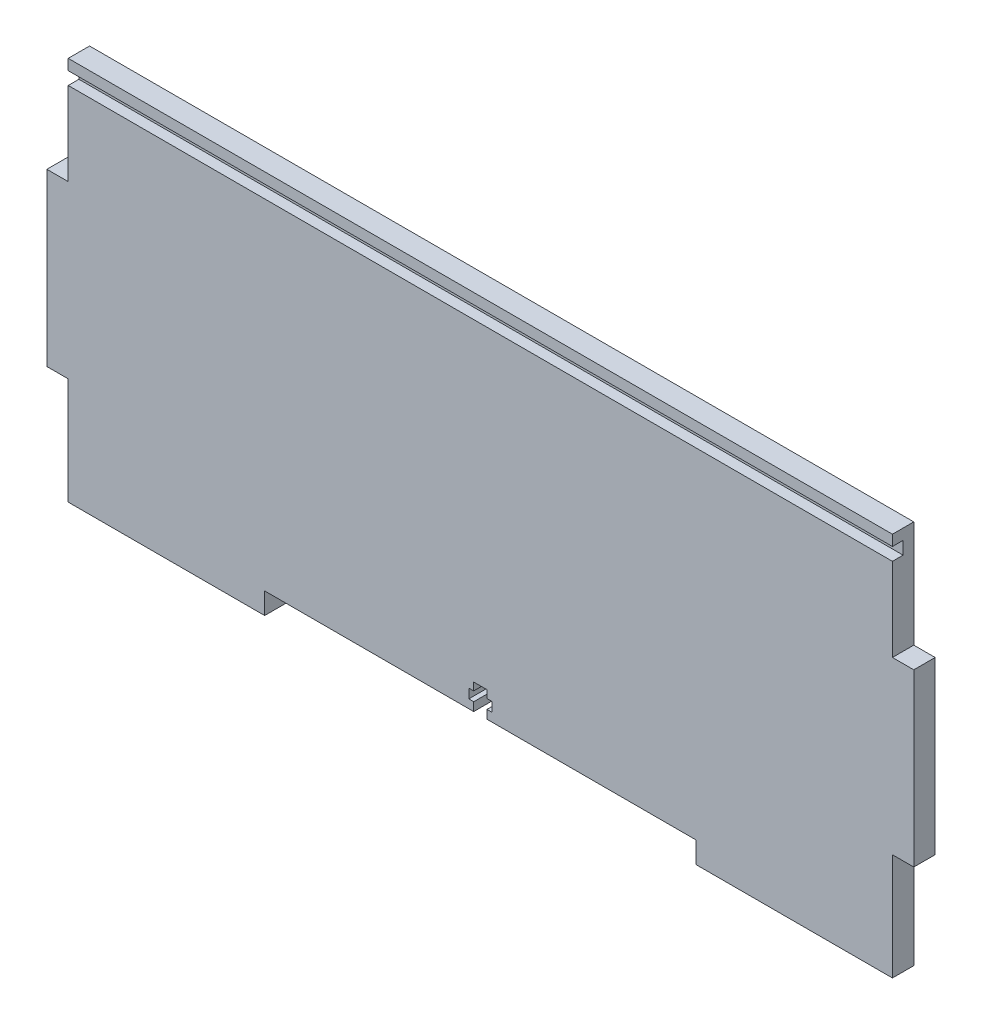
ISO-10303-21;
HEADER;
FILE_DESCRIPTION(('STEP AP214'),'2;1');
FILE_NAME('part.step','',(''),(''),'','','');
FILE_SCHEMA(('AUTOMOTIVE_DESIGN { 1 0 10303 214 1 1 1 1 }'));
ENDSEC;
DATA;
#1=APPLICATION_CONTEXT('core data for automotive mechanical design processes');
#2=APPLICATION_PROTOCOL_DEFINITION('international standard','automotive_design',2000,#1);
#3=PRODUCT_CONTEXT('',#1,'mechanical');
#4=PRODUCT('Part','Part','',(#3));
#5=PRODUCT_RELATED_PRODUCT_CATEGORY('part','',(#4));
#6=PRODUCT_DEFINITION_FORMATION('','',#4);
#7=PRODUCT_DEFINITION_CONTEXT('part definition',#1,'design');
#8=PRODUCT_DEFINITION('design','',#6,#7);
#9=PRODUCT_DEFINITION_SHAPE('','',#8);
#10=(LENGTH_UNIT() NAMED_UNIT(*) SI_UNIT(.MILLI.,.METRE.));
#11=(NAMED_UNIT(*) PLANE_ANGLE_UNIT() SI_UNIT($,.RADIAN.));
#12=(NAMED_UNIT(*) SI_UNIT($,.STERADIAN.) SOLID_ANGLE_UNIT());
#13=UNCERTAINTY_MEASURE_WITH_UNIT(LENGTH_MEASURE(1.E-05),#10,'distance_accuracy_value','');
#14=(GEOMETRIC_REPRESENTATION_CONTEXT(3) GLOBAL_UNCERTAINTY_ASSIGNED_CONTEXT((#13)) GLOBAL_UNIT_ASSIGNED_CONTEXT((#10,
#11,#12)) REPRESENTATION_CONTEXT('',''));
#15=CARTESIAN_POINT('',(0.,0.,0.));
#16=DIRECTION('',(0.,0.,1.));
#17=DIRECTION('',(1.,0.,0.));
#18=AXIS2_PLACEMENT_3D('',#15,#16,#17);
#19=CARTESIAN_POINT('',(0.,0.,5.));
#20=DIRECTION('',(0.,0.,-1.));
#21=DIRECTION('',(-1.,0.,0.));
#22=AXIS2_PLACEMENT_3D('',#19,#20,#21);
#23=PLANE('',#22);
#24=DIRECTION('',(0.,-1.,0.));
#25=VECTOR('',#24,1.);
#26=CARTESIAN_POINT('',(103.05,0.,5.));
#27=LINE('',#26,#25);
#28=CARTESIAN_POINT('',(103.05,7.,5.));
#29=VERTEX_POINT('',#28);
#30=CARTESIAN_POINT('',(103.05,5.,5.));
#31=VERTEX_POINT('',#30);
#32=EDGE_CURVE('E305',#29,#31,#27,.T.);
#33=ORIENTED_EDGE('',*,*,#32,.T.);
#34=DIRECTION('',(-1.,0.,0.));
#35=VECTOR('',#34,1.);
#36=CARTESIAN_POINT('',(51.,5.,5.));
#37=LINE('',#36,#35);
#38=CARTESIAN_POINT('',(152.,5.,5.));
#39=VERTEX_POINT('',#38);
#40=EDGE_CURVE('E388',#39,#31,#37,.T.);
#41=ORIENTED_EDGE('',*,*,#40,.F.);
#42=DIRECTION('',(0.,1.,0.));
#43=VECTOR('',#42,1.);
#44=CARTESIAN_POINT('',(152.,0.,5.));
#45=LINE('',#44,#43);
#46=CARTESIAN_POINT('',(152.,0.,5.));
#47=VERTEX_POINT('',#46);
#48=EDGE_CURVE('E396',#47,#39,#45,.T.);
#49=ORIENTED_EDGE('',*,*,#48,.F.);
#50=DIRECTION('',(1.,0.,0.));
#51=VECTOR('',#50,1.);
#52=CARTESIAN_POINT('',(0.,0.,5.));
#53=LINE('',#52,#51);
#54=CARTESIAN_POINT('',(198.,0.,5.));
#55=VERTEX_POINT('',#54);
#56=EDGE_CURVE('E470',#47,#55,#53,.T.);
#57=ORIENTED_EDGE('',*,*,#56,.T.);
#58=DIRECTION('',(0.,-1.,0.));
#59=VECTOR('',#58,1.);
#60=CARTESIAN_POINT('',(198.,0.,5.));
#61=LINE('',#60,#59);
#62=CARTESIAN_POINT('',(198.,25.,5.));
#63=VERTEX_POINT('',#62);
#64=EDGE_CURVE('E437',#63,#55,#61,.T.);
#65=ORIENTED_EDGE('',*,*,#64,.F.);
#66=DIRECTION('',(-1.,0.,0.));
#67=VECTOR('',#66,1.);
#68=CARTESIAN_POINT('',(203.,25.,5.));
#69=LINE('',#68,#67);
#70=CARTESIAN_POINT('',(203.,25.,5.));
#71=VERTEX_POINT('',#70);
#72=EDGE_CURVE('E379',#71,#63,#69,.T.);
#73=ORIENTED_EDGE('',*,*,#72,.F.);
#74=DIRECTION('',(0.,1.,0.));
#75=VECTOR('',#74,1.);
#76=CARTESIAN_POINT('',(203.,0.,5.));
#77=LINE('',#76,#75);
#78=CARTESIAN_POINT('',(203.,65.,5.));
#79=VERTEX_POINT('',#78);
#80=EDGE_CURVE('E42',#71,#79,#77,.T.);
#81=ORIENTED_EDGE('',*,*,#80,.T.);
#82=DIRECTION('',(1.,0.,0.));
#83=VECTOR('',#82,1.);
#84=CARTESIAN_POINT('',(203.,65.,5.));
#85=LINE('',#84,#83);
#86=CARTESIAN_POINT('',(198.,65.,5.));
#87=VERTEX_POINT('',#86);
#88=EDGE_CURVE('E367',#87,#79,#85,.T.);
#89=ORIENTED_EDGE('',*,*,#88,.F.);
#90=DIRECTION('',(0.,-1.,0.));
#91=VECTOR('',#90,1.);
#92=CARTESIAN_POINT('',(198.,65.,5.));
#93=LINE('',#92,#91);
#94=CARTESIAN_POINT('',(198.,84.5,5.));
#95=VERTEX_POINT('',#94);
#96=EDGE_CURVE('E374',#95,#87,#93,.T.);
#97=ORIENTED_EDGE('',*,*,#96,.F.);
#98=DIRECTION('',(1.,0.,0.));
#99=VECTOR('',#98,1.);
#100=CARTESIAN_POINT('',(4.99999999999998,84.5,5.));
#101=LINE('',#100,#99);
#102=CARTESIAN_POINT('',(4.99999999999998,84.5,5.));
#103=VERTEX_POINT('',#102);
#104=EDGE_CURVE('E321',#103,#95,#101,.T.);
#105=ORIENTED_EDGE('',*,*,#104,.F.);
#106=DIRECTION('',(0.,1.,0.));
#107=VECTOR('',#106,1.);
#108=CARTESIAN_POINT('',(4.99999999999997,65.,5.));
#109=LINE('',#108,#107);
#110=CARTESIAN_POINT('',(4.99999999999997,65.,5.));
#111=VERTEX_POINT('',#110);
#112=EDGE_CURVE('E415',#111,#103,#109,.T.);
#113=ORIENTED_EDGE('',*,*,#112,.F.);
#114=DIRECTION('',(1.,0.,0.));
#115=VECTOR('',#114,1.);
#116=CARTESIAN_POINT('',(0.,65.,5.));
#117=LINE('',#116,#115);
#118=CARTESIAN_POINT('',(0.,65.,5.));
#119=VERTEX_POINT('',#118);
#120=EDGE_CURVE('E419',#119,#111,#117,.T.);
#121=ORIENTED_EDGE('',*,*,#120,.F.);
#122=DIRECTION('',(0.,-1.,0.));
#123=VECTOR('',#122,1.);
#124=CARTESIAN_POINT('',(0.,0.,5.));
#125=LINE('',#124,#123);
#126=CARTESIAN_POINT('',(0.,25.,5.));
#127=VERTEX_POINT('',#126);
#128=EDGE_CURVE('E468',#119,#127,#125,.T.);
#129=ORIENTED_EDGE('',*,*,#128,.T.);
#130=DIRECTION('',(-1.,0.,0.));
#131=VECTOR('',#130,1.);
#132=CARTESIAN_POINT('',(0.,25.,5.));
#133=LINE('',#132,#131);
#134=CARTESIAN_POINT('',(5.,25.,5.));
#135=VERTEX_POINT('',#134);
#136=EDGE_CURVE('E453',#135,#127,#133,.T.);
#137=ORIENTED_EDGE('',*,*,#136,.F.);
#138=DIRECTION('',(0.,1.,0.));
#139=VECTOR('',#138,1.);
#140=CARTESIAN_POINT('',(5.,25.,5.));
#141=LINE('',#140,#139);
#142=CARTESIAN_POINT('',(5.,0.,5.));
#143=VERTEX_POINT('',#142);
#144=EDGE_CURVE('E429',#143,#135,#141,.T.);
#145=ORIENTED_EDGE('',*,*,#144,.F.);
#146=CARTESIAN_POINT('',(51.,0.,5.));
#147=VERTEX_POINT('',#146);
#148=EDGE_CURVE('E471',#143,#147,#53,.T.);
#149=ORIENTED_EDGE('',*,*,#148,.T.);
#150=DIRECTION('',(0.,-1.,0.));
#151=VECTOR('',#150,1.);
#152=CARTESIAN_POINT('',(51.,0.,5.));
#153=LINE('',#152,#151);
#154=CARTESIAN_POINT('',(51.,5.,5.));
#155=VERTEX_POINT('',#154);
#156=EDGE_CURVE('E356',#155,#147,#153,.T.);
#157=ORIENTED_EDGE('',*,*,#156,.F.);
#158=CARTESIAN_POINT('',(99.95,5.,5.));
#159=VERTEX_POINT('',#158);
#160=EDGE_CURVE('E399',#159,#155,#37,.T.);
#161=ORIENTED_EDGE('',*,*,#160,.F.);
#162=DIRECTION('',(0.,-1.,0.));
#163=VECTOR('',#162,1.);
#164=CARTESIAN_POINT('',(99.95,0.,5.));
#165=LINE('',#164,#163);
#166=CARTESIAN_POINT('',(99.95,7.,5.));
#167=VERTEX_POINT('',#166);
#168=EDGE_CURVE('E50',#167,#159,#165,.T.);
#169=ORIENTED_EDGE('',*,*,#168,.F.);
#170=DIRECTION('',(-1.,0.,0.));
#171=VECTOR('',#170,1.);
#172=CARTESIAN_POINT('',(0.,6.99999999999998,5.));
#173=LINE('',#172,#171);
#174=CARTESIAN_POINT('',(98.8,7.,5.));
#175=VERTEX_POINT('',#174);
#176=EDGE_CURVE('E301',#167,#175,#173,.T.);
#177=ORIENTED_EDGE('',*,*,#176,.T.);
#178=DIRECTION('',(0.,1.,0.));
#179=VECTOR('',#178,1.);
#180=CARTESIAN_POINT('',(98.8,0.,5.));
#181=LINE('',#180,#179);
#182=CARTESIAN_POINT('',(98.8,9.2,5.));
#183=VERTEX_POINT('',#182);
#184=EDGE_CURVE('E298',#175,#183,#181,.T.);
#185=ORIENTED_EDGE('',*,*,#184,.T.);
#186=DIRECTION('',(-1.,0.,0.));
#187=VECTOR('',#186,1.);
#188=CARTESIAN_POINT('',(0.,9.20000000000003,5.));
#189=LINE('',#188,#187);
#190=CARTESIAN_POINT('',(99.95,9.2,5.));
#191=VERTEX_POINT('',#190);
#192=EDGE_CURVE('E296',#191,#183,#189,.T.);
#193=ORIENTED_EDGE('',*,*,#192,.F.);
#194=DIRECTION('',(0.,-1.,0.));
#195=VECTOR('',#194,1.);
#196=CARTESIAN_POINT('',(99.95,0.,5.));
#197=LINE('',#196,#195);
#198=CARTESIAN_POINT('',(99.95,11.,5.));
#199=VERTEX_POINT('',#198);
#200=EDGE_CURVE('E251',#199,#191,#197,.T.);
#201=ORIENTED_EDGE('',*,*,#200,.F.);
#202=DIRECTION('',(-1.,0.,0.));
#203=VECTOR('',#202,1.);
#204=CARTESIAN_POINT('',(0.,11.,5.));
#205=LINE('',#204,#203);
#206=CARTESIAN_POINT('',(103.05,11.,5.));
#207=VERTEX_POINT('',#206);
#208=EDGE_CURVE('E270',#207,#199,#205,.T.);
#209=ORIENTED_EDGE('',*,*,#208,.F.);
#210=DIRECTION('',(0.,-1.,0.));
#211=VECTOR('',#210,1.);
#212=CARTESIAN_POINT('',(103.05,0.,5.));
#213=LINE('',#212,#211);
#214=CARTESIAN_POINT('',(103.05,9.2,5.));
#215=VERTEX_POINT('',#214);
#216=EDGE_CURVE('E273',#207,#215,#213,.T.);
#217=ORIENTED_EDGE('',*,*,#216,.T.);
#218=DIRECTION('',(-1.,0.,0.));
#219=VECTOR('',#218,1.);
#220=CARTESIAN_POINT('',(0.,9.20000000000003,5.));
#221=LINE('',#220,#219);
#222=CARTESIAN_POINT('',(104.2,9.2,5.));
#223=VERTEX_POINT('',#222);
#224=EDGE_CURVE('E314',#223,#215,#221,.T.);
#225=ORIENTED_EDGE('',*,*,#224,.F.);
#226=DIRECTION('',(0.,1.,0.));
#227=VECTOR('',#226,1.);
#228=CARTESIAN_POINT('',(104.2,0.,5.));
#229=LINE('',#228,#227);
#230=CARTESIAN_POINT('',(104.2,7.,5.));
#231=VERTEX_POINT('',#230);
#232=EDGE_CURVE('E311',#231,#223,#229,.T.);
#233=ORIENTED_EDGE('',*,*,#232,.F.);
#234=DIRECTION('',(-1.,0.,0.));
#235=VECTOR('',#234,1.);
#236=CARTESIAN_POINT('',(0.,6.99999999999998,5.));
#237=LINE('',#236,#235);
#238=EDGE_CURVE('E308',#231,#29,#237,.T.);
#239=ORIENTED_EDGE('',*,*,#238,.T.);
#240=EDGE_LOOP('',(#33,#41,#49,#57,#65,#73,#81,#89,#97,#105,#113,#121,#129,#137,#145,#149,#157,
#161,#169,#177,#185,#193,#201,#209,#217,#225,#233,#239));
#241=FACE_BOUND('',#240,.T.);
#242=ADVANCED_FACE('F33',(#241),#23,.F.);
#243=CARTESIAN_POINT('',(0.,0.,0.));
#244=DIRECTION('',(0.,0.,-1.));
#245=DIRECTION('',(-1.,0.,0.));
#246=AXIS2_PLACEMENT_3D('',#243,#244,#245);
#247=PLANE('',#246);
#248=DIRECTION('',(-1.,0.,0.));
#249=VECTOR('',#248,1.);
#250=CARTESIAN_POINT('',(51.,5.,0.));
#251=LINE('',#250,#249);
#252=CARTESIAN_POINT('',(152.,5.,0.));
#253=VERTEX_POINT('',#252);
#254=CARTESIAN_POINT('',(103.05,5.,0.));
#255=VERTEX_POINT('',#254);
#256=EDGE_CURVE('E392',#253,#255,#251,.T.);
#257=ORIENTED_EDGE('',*,*,#256,.T.);
#258=DIRECTION('',(0.,-1.,0.));
#259=VECTOR('',#258,1.);
#260=CARTESIAN_POINT('',(103.05,0.,0.));
#261=LINE('',#260,#259);
#262=CARTESIAN_POINT('',(103.05,7.,0.));
#263=VERTEX_POINT('',#262);
#264=EDGE_CURVE('E282',#263,#255,#261,.T.);
#265=ORIENTED_EDGE('',*,*,#264,.F.);
#266=DIRECTION('',(-1.,0.,0.));
#267=VECTOR('',#266,1.);
#268=CARTESIAN_POINT('',(0.,6.99999999999998,0.));
#269=LINE('',#268,#267);
#270=CARTESIAN_POINT('',(104.2,7.,0.));
#271=VERTEX_POINT('',#270);
#272=EDGE_CURVE('E284',#271,#263,#269,.T.);
#273=ORIENTED_EDGE('',*,*,#272,.F.);
#274=DIRECTION('',(0.,1.,0.));
#275=VECTOR('',#274,1.);
#276=CARTESIAN_POINT('',(104.2,0.,0.));
#277=LINE('',#276,#275);
#278=CARTESIAN_POINT('',(104.2,9.2,0.));
#279=VERTEX_POINT('',#278);
#280=EDGE_CURVE('E286',#271,#279,#277,.T.);
#281=ORIENTED_EDGE('',*,*,#280,.T.);
#282=DIRECTION('',(-1.,0.,0.));
#283=VECTOR('',#282,1.);
#284=CARTESIAN_POINT('',(0.,9.20000000000003,0.));
#285=LINE('',#284,#283);
#286=CARTESIAN_POINT('',(103.05,9.2,0.));
#287=VERTEX_POINT('',#286);
#288=EDGE_CURVE('E289',#279,#287,#285,.T.);
#289=ORIENTED_EDGE('',*,*,#288,.T.);
#290=DIRECTION('',(0.,-1.,0.));
#291=VECTOR('',#290,1.);
#292=CARTESIAN_POINT('',(103.05,0.,0.));
#293=LINE('',#292,#291);
#294=CARTESIAN_POINT('',(103.05,11.,0.));
#295=VERTEX_POINT('',#294);
#296=EDGE_CURVE('E292',#295,#287,#293,.T.);
#297=ORIENTED_EDGE('',*,*,#296,.F.);
#298=DIRECTION('',(-1.,0.,0.));
#299=VECTOR('',#298,1.);
#300=CARTESIAN_POINT('',(0.,11.,0.));
#301=LINE('',#300,#299);
#302=CARTESIAN_POINT('',(99.95,11.,0.));
#303=VERTEX_POINT('',#302);
#304=EDGE_CURVE('E256',#295,#303,#301,.T.);
#305=ORIENTED_EDGE('',*,*,#304,.T.);
#306=DIRECTION('',(0.,-1.,0.));
#307=VECTOR('',#306,1.);
#308=CARTESIAN_POINT('',(99.95,0.,0.));
#309=LINE('',#308,#307);
#310=CARTESIAN_POINT('',(99.95,9.2,0.));
#311=VERTEX_POINT('',#310);
#312=EDGE_CURVE('E248',#303,#311,#309,.T.);
#313=ORIENTED_EDGE('',*,*,#312,.T.);
#314=DIRECTION('',(-1.,0.,0.));
#315=VECTOR('',#314,1.);
#316=CARTESIAN_POINT('',(0.,9.20000000000003,0.));
#317=LINE('',#316,#315);
#318=CARTESIAN_POINT('',(98.8,9.2,0.));
#319=VERTEX_POINT('',#318);
#320=EDGE_CURVE('E260',#311,#319,#317,.T.);
#321=ORIENTED_EDGE('',*,*,#320,.T.);
#322=DIRECTION('',(0.,1.,0.));
#323=VECTOR('',#322,1.);
#324=CARTESIAN_POINT('',(98.8,0.,0.));
#325=LINE('',#324,#323);
#326=CARTESIAN_POINT('',(98.8,7.,0.));
#327=VERTEX_POINT('',#326);
#328=EDGE_CURVE('E264',#327,#319,#325,.T.);
#329=ORIENTED_EDGE('',*,*,#328,.F.);
#330=DIRECTION('',(-1.,0.,0.));
#331=VECTOR('',#330,1.);
#332=CARTESIAN_POINT('',(0.,6.99999999999998,0.));
#333=LINE('',#332,#331);
#334=CARTESIAN_POINT('',(99.95,7.,0.));
#335=VERTEX_POINT('',#334);
#336=EDGE_CURVE('E277',#335,#327,#333,.T.);
#337=ORIENTED_EDGE('',*,*,#336,.F.);
#338=DIRECTION('',(0.,-1.,0.));
#339=VECTOR('',#338,1.);
#340=CARTESIAN_POINT('',(99.95,0.,0.));
#341=LINE('',#340,#339);
#342=CARTESIAN_POINT('',(99.95,5.,0.));
#343=VERTEX_POINT('',#342);
#344=EDGE_CURVE('E279',#335,#343,#341,.T.);
#345=ORIENTED_EDGE('',*,*,#344,.T.);
#346=CARTESIAN_POINT('',(51.,5.,0.));
#347=VERTEX_POINT('',#346);
#348=EDGE_CURVE('E391',#343,#347,#251,.T.);
#349=ORIENTED_EDGE('',*,*,#348,.T.);
#350=DIRECTION('',(0.,-1.,0.));
#351=VECTOR('',#350,1.);
#352=CARTESIAN_POINT('',(51.,0.,0.));
#353=LINE('',#352,#351);
#354=CARTESIAN_POINT('',(51.,0.,0.));
#355=VERTEX_POINT('',#354);
#356=EDGE_CURVE('E384',#347,#355,#353,.T.);
#357=ORIENTED_EDGE('',*,*,#356,.T.);
#358=DIRECTION('',(1.,0.,0.));
#359=VECTOR('',#358,1.);
#360=CARTESIAN_POINT('',(0.,0.,0.));
#361=LINE('',#360,#359);
#362=CARTESIAN_POINT('',(5.,0.,0.));
#363=VERTEX_POINT('',#362);
#364=EDGE_CURVE('E478',#363,#355,#361,.T.);
#365=ORIENTED_EDGE('',*,*,#364,.F.);
#366=DIRECTION('',(0.,1.,0.));
#367=VECTOR('',#366,1.);
#368=CARTESIAN_POINT('',(5.,25.,0.));
#369=LINE('',#368,#367);
#370=CARTESIAN_POINT('',(5.,25.,0.));
#371=VERTEX_POINT('',#370);
#372=EDGE_CURVE('E449',#363,#371,#369,.T.);
#373=ORIENTED_EDGE('',*,*,#372,.T.);
#374=DIRECTION('',(-1.,0.,0.));
#375=VECTOR('',#374,1.);
#376=CARTESIAN_POINT('',(0.,25.,0.));
#377=LINE('',#376,#375);
#378=CARTESIAN_POINT('',(0.,25.,0.));
#379=VERTEX_POINT('',#378);
#380=EDGE_CURVE('E452',#371,#379,#377,.T.);
#381=ORIENTED_EDGE('',*,*,#380,.T.);
#382=DIRECTION('',(0.,-1.,0.));
#383=VECTOR('',#382,1.);
#384=CARTESIAN_POINT('',(0.,0.,0.));
#385=LINE('',#384,#383);
#386=CARTESIAN_POINT('',(0.,65.,0.));
#387=VERTEX_POINT('',#386);
#388=EDGE_CURVE('E464',#387,#379,#385,.T.);
#389=ORIENTED_EDGE('',*,*,#388,.F.);
#390=DIRECTION('',(1.,0.,0.));
#391=VECTOR('',#390,1.);
#392=CARTESIAN_POINT('',(0.,65.,0.));
#393=LINE('',#392,#391);
#394=CARTESIAN_POINT('',(4.99999999999997,65.,0.));
#395=VERTEX_POINT('',#394);
#396=EDGE_CURVE('E411',#387,#395,#393,.T.);
#397=ORIENTED_EDGE('',*,*,#396,.T.);
#398=DIRECTION('',(0.,1.,0.));
#399=VECTOR('',#398,1.);
#400=CARTESIAN_POINT('',(4.99999999999997,65.,0.));
#401=LINE('',#400,#399);
#402=CARTESIAN_POINT('',(4.99999999999997,90.,0.));
#403=VERTEX_POINT('',#402);
#404=EDGE_CURVE('E414',#395,#403,#401,.T.);
#405=ORIENTED_EDGE('',*,*,#404,.T.);
#406=DIRECTION('',(-1.,0.,0.));
#407=VECTOR('',#406,1.);
#408=CARTESIAN_POINT('',(0.,90.,0.));
#409=LINE('',#408,#407);
#410=CARTESIAN_POINT('',(198.,90.,0.));
#411=VERTEX_POINT('',#410);
#412=EDGE_CURVE('E37',#411,#403,#409,.T.);
#413=ORIENTED_EDGE('',*,*,#412,.F.);
#414=DIRECTION('',(0.,-1.,0.));
#415=VECTOR('',#414,1.);
#416=CARTESIAN_POINT('',(198.,65.,0.));
#417=LINE('',#416,#415);
#418=CARTESIAN_POINT('',(198.,65.,0.));
#419=VERTEX_POINT('',#418);
#420=EDGE_CURVE('E363',#411,#419,#417,.T.);
#421=ORIENTED_EDGE('',*,*,#420,.T.);
#422=DIRECTION('',(1.,0.,0.));
#423=VECTOR('',#422,1.);
#424=CARTESIAN_POINT('',(203.,65.,0.));
#425=LINE('',#424,#423);
#426=CARTESIAN_POINT('',(203.,65.,0.));
#427=VERTEX_POINT('',#426);
#428=EDGE_CURVE('E366',#419,#427,#425,.T.);
#429=ORIENTED_EDGE('',*,*,#428,.T.);
#430=DIRECTION('',(0.,1.,0.));
#431=VECTOR('',#430,1.);
#432=CARTESIAN_POINT('',(203.,0.,0.));
#433=LINE('',#432,#431);
#434=CARTESIAN_POINT('',(203.,25.,0.));
#435=VERTEX_POINT('',#434);
#436=EDGE_CURVE('E480',#435,#427,#433,.T.);
#437=ORIENTED_EDGE('',*,*,#436,.F.);
#438=DIRECTION('',(-1.,0.,0.));
#439=VECTOR('',#438,1.);
#440=CARTESIAN_POINT('',(203.,25.,0.));
#441=LINE('',#440,#439);
#442=CARTESIAN_POINT('',(198.,25.,0.));
#443=VERTEX_POINT('',#442);
#444=EDGE_CURVE('E433',#435,#443,#441,.T.);
#445=ORIENTED_EDGE('',*,*,#444,.T.);
#446=DIRECTION('',(0.,-1.,0.));
#447=VECTOR('',#446,1.);
#448=CARTESIAN_POINT('',(198.,0.,0.));
#449=LINE('',#448,#447);
#450=CARTESIAN_POINT('',(198.,0.,0.));
#451=VERTEX_POINT('',#450);
#452=EDGE_CURVE('E436',#443,#451,#449,.T.);
#453=ORIENTED_EDGE('',*,*,#452,.T.);
#454=CARTESIAN_POINT('',(152.,0.,0.));
#455=VERTEX_POINT('',#454);
#456=EDGE_CURVE('E477',#455,#451,#361,.T.);
#457=ORIENTED_EDGE('',*,*,#456,.F.);
#458=DIRECTION('',(0.,1.,0.));
#459=VECTOR('',#458,1.);
#460=CARTESIAN_POINT('',(152.,0.,0.));
#461=LINE('',#460,#459);
#462=EDGE_CURVE('E387',#455,#253,#461,.T.);
#463=ORIENTED_EDGE('',*,*,#462,.T.);
#464=EDGE_LOOP('',(#257,#265,#273,#281,#289,#297,#305,#313,#321,#329,#337,#345,#349,#357,#365,
#373,#381,#389,#397,#405,#413,#421,#429,#437,#445,#453,#457,#463));
#465=FACE_BOUND('',#464,.T.);
#466=ADVANCED_FACE('F267',(#465),#247,.T.);
#467=CARTESIAN_POINT('',(51.,5.,0.));
#468=DIRECTION('',(0.,1.,0.));
#469=DIRECTION('',(0.,0.,1.));
#470=AXIS2_PLACEMENT_3D('',#467,#468,#469);
#471=PLANE('',#470);
#472=DIRECTION('',(0.,0.,1.));
#473=VECTOR('',#472,1.);
#474=CARTESIAN_POINT('',(103.05,5.,0.));
#475=LINE('',#474,#473);
#476=EDGE_CURVE('E332',#255,#31,#475,.T.);
#477=ORIENTED_EDGE('',*,*,#476,.F.);
#478=ORIENTED_EDGE('',*,*,#256,.F.);
#479=DIRECTION('',(0.,0.,1.));
#480=VECTOR('',#479,1.);
#481=CARTESIAN_POINT('',(152.,5.,0.));
#482=LINE('',#481,#480);
#483=EDGE_CURVE('E405',#253,#39,#482,.T.);
#484=ORIENTED_EDGE('',*,*,#483,.T.);
#485=ORIENTED_EDGE('',*,*,#40,.T.);
#486=EDGE_LOOP('',(#477,#478,#484,#485));
#487=FACE_BOUND('',#486,.T.);
#488=ADVANCED_FACE('F523',(#487),#471,.F.);
#489=CARTESIAN_POINT('',(4.99999999999997,87.5,5.));
#490=VERTEX_POINT('',#489);
#491=CARTESIAN_POINT('',(4.99999999999997,90.,5.));
#492=VERTEX_POINT('',#491);
#493=EDGE_CURVE('E422',#490,#492,#109,.T.);
#494=ORIENTED_EDGE('',*,*,#493,.F.);
#495=DIRECTION('',(-1.,0.,0.));
#496=VECTOR('',#495,1.);
#497=CARTESIAN_POINT('',(4.99999999999997,87.5,5.));
#498=LINE('',#497,#496);
#499=CARTESIAN_POINT('',(198.,87.5,5.));
#500=VERTEX_POINT('',#499);
#501=EDGE_CURVE('E343',#500,#490,#498,.T.);
#502=ORIENTED_EDGE('',*,*,#501,.F.);
#503=CARTESIAN_POINT('',(198.,90.,5.));
#504=VERTEX_POINT('',#503);
#505=EDGE_CURVE('E371',#504,#500,#93,.T.);
#506=ORIENTED_EDGE('',*,*,#505,.F.);
#507=DIRECTION('',(-1.,0.,0.));
#508=VECTOR('',#507,1.);
#509=CARTESIAN_POINT('',(0.,90.,5.));
#510=LINE('',#509,#508);
#511=EDGE_CURVE('E11',#504,#492,#510,.T.);
#512=ORIENTED_EDGE('',*,*,#511,.T.);
#513=EDGE_LOOP('',(#494,#502,#506,#512));
#514=FACE_BOUND('',#513,.T.);
#515=ADVANCED_FACE('F520',(#514),#23,.F.);
#516=CARTESIAN_POINT('',(0.,0.,5.));
#517=DIRECTION('',(0.,1.,0.));
#518=DIRECTION('',(0.,0.,1.));
#519=AXIS2_PLACEMENT_3D('',#516,#517,#518);
#520=PLANE('',#519);
#521=ORIENTED_EDGE('',*,*,#364,.T.);
#522=DIRECTION('',(0.,0.,1.));
#523=VECTOR('',#522,1.);
#524=CARTESIAN_POINT('',(51.,0.,0.));
#525=LINE('',#524,#523);
#526=EDGE_CURVE('E394',#355,#147,#525,.T.);
#527=ORIENTED_EDGE('',*,*,#526,.T.);
#528=ORIENTED_EDGE('',*,*,#148,.F.);
#529=DIRECTION('',(0.,0.,1.));
#530=VECTOR('',#529,1.);
#531=CARTESIAN_POINT('',(5.,0.,0.));
#532=LINE('',#531,#530);
#533=EDGE_CURVE('E456',#363,#143,#532,.T.);
#534=ORIENTED_EDGE('',*,*,#533,.F.);
#535=EDGE_LOOP('',(#521,#527,#528,#534));
#536=FACE_BOUND('',#535,.T.);
#537=ADVANCED_FACE('F522',(#536),#520,.F.);
#538=CARTESIAN_POINT('',(0.,0.,5.));
#539=DIRECTION('',(1.,0.,0.));
#540=DIRECTION('',(0.,0.,-1.));
#541=AXIS2_PLACEMENT_3D('',#538,#539,#540);
#542=PLANE('',#541);
#543=ORIENTED_EDGE('',*,*,#128,.F.);
#544=DIRECTION('',(0.,0.,1.));
#545=VECTOR('',#544,1.);
#546=CARTESIAN_POINT('',(0.,65.,0.));
#547=LINE('',#546,#545);
#548=EDGE_CURVE('E418',#387,#119,#547,.T.);
#549=ORIENTED_EDGE('',*,*,#548,.F.);
#550=ORIENTED_EDGE('',*,*,#388,.T.);
#551=DIRECTION('',(0.,0.,1.));
#552=VECTOR('',#551,1.);
#553=CARTESIAN_POINT('',(0.,25.,0.));
#554=LINE('',#553,#552);
#555=EDGE_CURVE('E461',#379,#127,#554,.T.);
#556=ORIENTED_EDGE('',*,*,#555,.T.);
#557=EDGE_LOOP('',(#543,#549,#550,#556));
#558=FACE_BOUND('',#557,.T.);
#559=ADVANCED_FACE('F35',(#558),#542,.F.);
#560=ORIENTED_EDGE('',*,*,#56,.F.);
#561=DIRECTION('',(0.,0.,1.));
#562=VECTOR('',#561,1.);
#563=CARTESIAN_POINT('',(152.,0.,0.));
#564=LINE('',#563,#562);
#565=EDGE_CURVE('E407',#455,#47,#564,.T.);
#566=ORIENTED_EDGE('',*,*,#565,.F.);
#567=ORIENTED_EDGE('',*,*,#456,.T.);
#568=DIRECTION('',(0.,0.,1.));
#569=VECTOR('',#568,1.);
#570=CARTESIAN_POINT('',(198.,0.,0.));
#571=LINE('',#570,#569);
#572=EDGE_CURVE('E423',#451,#55,#571,.T.);
#573=ORIENTED_EDGE('',*,*,#572,.T.);
#574=EDGE_LOOP('',(#560,#566,#567,#573));
#575=FACE_BOUND('',#574,.T.);
#576=ADVANCED_FACE('F530',(#575),#520,.F.);
#577=CARTESIAN_POINT('',(203.,0.,5.));
#578=DIRECTION('',(-1.,0.,0.));
#579=DIRECTION('',(0.,0.,1.));
#580=AXIS2_PLACEMENT_3D('',#577,#578,#579);
#581=PLANE('',#580);
#582=ORIENTED_EDGE('',*,*,#436,.T.);
#583=DIRECTION('',(0.,0.,1.));
#584=VECTOR('',#583,1.);
#585=CARTESIAN_POINT('',(203.,65.,0.));
#586=LINE('',#585,#584);
#587=EDGE_CURVE('E376',#427,#79,#586,.T.);
#588=ORIENTED_EDGE('',*,*,#587,.T.);
#589=ORIENTED_EDGE('',*,*,#80,.F.);
#590=DIRECTION('',(0.,0.,1.));
#591=VECTOR('',#590,1.);
#592=CARTESIAN_POINT('',(203.,25.,0.));
#593=LINE('',#592,#591);
#594=EDGE_CURVE('E440',#435,#71,#593,.T.);
#595=ORIENTED_EDGE('',*,*,#594,.F.);
#596=EDGE_LOOP('',(#582,#588,#589,#595));
#597=FACE_BOUND('',#596,.T.);
#598=ADVANCED_FACE('F546',(#597),#581,.F.);
#599=CARTESIAN_POINT('',(0.,90.,5.));
#600=DIRECTION('',(0.,-1.,0.));
#601=DIRECTION('',(0.,0.,-1.));
#602=AXIS2_PLACEMENT_3D('',#599,#600,#601);
#603=PLANE('',#602);
#604=ORIENTED_EDGE('',*,*,#511,.F.);
#605=DIRECTION('',(0.,0.,1.));
#606=VECTOR('',#605,1.);
#607=CARTESIAN_POINT('',(198.,90.,0.));
#608=LINE('',#607,#606);
#609=EDGE_CURVE('E370',#411,#504,#608,.T.);
#610=ORIENTED_EDGE('',*,*,#609,.F.);
#611=ORIENTED_EDGE('',*,*,#412,.T.);
#612=DIRECTION('',(0.,0.,1.));
#613=VECTOR('',#612,1.);
#614=CARTESIAN_POINT('',(4.99999999999997,90.,0.));
#615=LINE('',#614,#613);
#616=EDGE_CURVE('E426',#403,#492,#615,.T.);
#617=ORIENTED_EDGE('',*,*,#616,.T.);
#618=EDGE_LOOP('',(#604,#610,#611,#617));
#619=FACE_BOUND('',#618,.T.);
#620=ADVANCED_FACE('F490',(#619),#603,.F.);
#621=CARTESIAN_POINT('',(0.,25.,0.));
#622=DIRECTION('',(0.,1.,0.));
#623=DIRECTION('',(-1.,0.,0.));
#624=AXIS2_PLACEMENT_3D('',#621,#622,#623);
#625=PLANE('',#624);
#626=ORIENTED_EDGE('',*,*,#136,.T.);
#627=ORIENTED_EDGE('',*,*,#555,.F.);
#628=ORIENTED_EDGE('',*,*,#380,.F.);
#629=DIRECTION('',(0.,0.,1.));
#630=VECTOR('',#629,1.);
#631=CARTESIAN_POINT('',(5.,25.,0.));
#632=LINE('',#631,#630);
#633=EDGE_CURVE('E465',#371,#135,#632,.T.);
#634=ORIENTED_EDGE('',*,*,#633,.T.);
#635=EDGE_LOOP('',(#626,#627,#628,#634));
#636=FACE_BOUND('',#635,.T.);
#637=ADVANCED_FACE('F545',(#636),#625,.F.);
#638=CARTESIAN_POINT('',(5.,25.,0.));
#639=DIRECTION('',(1.,0.,0.));
#640=DIRECTION('',(0.,1.,0.));
#641=AXIS2_PLACEMENT_3D('',#638,#639,#640);
#642=PLANE('',#641);
#643=ORIENTED_EDGE('',*,*,#144,.T.);
#644=ORIENTED_EDGE('',*,*,#633,.F.);
#645=ORIENTED_EDGE('',*,*,#372,.F.);
#646=ORIENTED_EDGE('',*,*,#533,.T.);
#647=EDGE_LOOP('',(#643,#644,#645,#646));
#648=FACE_BOUND('',#647,.T.);
#649=ADVANCED_FACE('F598',(#648),#642,.F.);
#650=CARTESIAN_POINT('',(4.99999999999997,65.,0.));
#651=DIRECTION('',(1.,0.,0.));
#652=DIRECTION('',(0.,1.,0.));
#653=AXIS2_PLACEMENT_3D('',#650,#651,#652);
#654=PLANE('',#653);
#655=DIRECTION('',(0.,-1.,0.));
#656=VECTOR('',#655,1.);
#657=CARTESIAN_POINT('',(4.99999999999997,87.5,2.5));
#658=LINE('',#657,#656);
#659=CARTESIAN_POINT('',(4.99999999999997,87.5,2.5));
#660=VERTEX_POINT('',#659);
#661=CARTESIAN_POINT('',(4.99999999999998,84.5,2.5));
#662=VERTEX_POINT('',#661);
#663=EDGE_CURVE('E341',#660,#662,#658,.T.);
#664=ORIENTED_EDGE('',*,*,#663,.F.);
#665=DIRECTION('',(0.,0.,1.));
#666=VECTOR('',#665,1.);
#667=CARTESIAN_POINT('',(4.99999999999997,87.5,2.5));
#668=LINE('',#667,#666);
#669=EDGE_CURVE('E353',#660,#490,#668,.T.);
#670=ORIENTED_EDGE('',*,*,#669,.T.);
#671=ORIENTED_EDGE('',*,*,#493,.T.);
#672=ORIENTED_EDGE('',*,*,#616,.F.);
#673=ORIENTED_EDGE('',*,*,#404,.F.);
#674=DIRECTION('',(0.,0.,1.));
#675=VECTOR('',#674,1.);
#676=CARTESIAN_POINT('',(4.99999999999997,65.,0.));
#677=LINE('',#676,#675);
#678=EDGE_CURVE('E430',#395,#111,#677,.T.);
#679=ORIENTED_EDGE('',*,*,#678,.T.);
#680=ORIENTED_EDGE('',*,*,#112,.T.);
#681=DIRECTION('',(0.,0.,1.));
#682=VECTOR('',#681,1.);
#683=CARTESIAN_POINT('',(4.99999999999998,84.5,2.5));
#684=LINE('',#683,#682);
#685=EDGE_CURVE('E350',#662,#103,#684,.T.);
#686=ORIENTED_EDGE('',*,*,#685,.F.);
#687=EDGE_LOOP('',(#664,#670,#671,#672,#673,#679,#680,#686));
#688=FACE_BOUND('',#687,.T.);
#689=ADVANCED_FACE('F495',(#688),#654,.F.);
#690=CARTESIAN_POINT('',(0.,65.,0.));
#691=DIRECTION('',(0.,-1.,0.));
#692=DIRECTION('',(0.,0.,-1.));
#693=AXIS2_PLACEMENT_3D('',#690,#691,#692);
#694=PLANE('',#693);
#695=ORIENTED_EDGE('',*,*,#120,.T.);
#696=ORIENTED_EDGE('',*,*,#678,.F.);
#697=ORIENTED_EDGE('',*,*,#396,.F.);
#698=ORIENTED_EDGE('',*,*,#548,.T.);
#699=EDGE_LOOP('',(#695,#696,#697,#698));
#700=FACE_BOUND('',#699,.T.);
#701=ADVANCED_FACE('F497',(#700),#694,.F.);
#702=CARTESIAN_POINT('',(198.,0.,0.));
#703=DIRECTION('',(-1.,0.,0.));
#704=DIRECTION('',(0.,0.,1.));
#705=AXIS2_PLACEMENT_3D('',#702,#703,#704);
#706=PLANE('',#705);
#707=ORIENTED_EDGE('',*,*,#64,.T.);
#708=ORIENTED_EDGE('',*,*,#572,.F.);
#709=ORIENTED_EDGE('',*,*,#452,.F.);
#710=DIRECTION('',(0.,0.,1.));
#711=VECTOR('',#710,1.);
#712=CARTESIAN_POINT('',(198.,25.,0.));
#713=LINE('',#712,#711);
#714=EDGE_CURVE('E446',#443,#63,#713,.T.);
#715=ORIENTED_EDGE('',*,*,#714,.T.);
#716=EDGE_LOOP('',(#707,#708,#709,#715));
#717=FACE_BOUND('',#716,.T.);
#718=ADVANCED_FACE('F569',(#717),#706,.F.);
#719=CARTESIAN_POINT('',(203.,25.,0.));
#720=DIRECTION('',(0.,1.,0.));
#721=DIRECTION('',(0.,0.,1.));
#722=AXIS2_PLACEMENT_3D('',#719,#720,#721);
#723=PLANE('',#722);
#724=ORIENTED_EDGE('',*,*,#72,.T.);
#725=ORIENTED_EDGE('',*,*,#714,.F.);
#726=ORIENTED_EDGE('',*,*,#444,.F.);
#727=ORIENTED_EDGE('',*,*,#594,.T.);
#728=EDGE_LOOP('',(#724,#725,#726,#727));
#729=FACE_BOUND('',#728,.T.);
#730=ADVANCED_FACE('F571',(#729),#723,.F.);
#731=CARTESIAN_POINT('',(203.,65.,0.));
#732=DIRECTION('',(0.,-1.,0.));
#733=DIRECTION('',(0.,0.,-1.));
#734=AXIS2_PLACEMENT_3D('',#731,#732,#733);
#735=PLANE('',#734);
#736=ORIENTED_EDGE('',*,*,#88,.T.);
#737=ORIENTED_EDGE('',*,*,#587,.F.);
#738=ORIENTED_EDGE('',*,*,#428,.F.);
#739=DIRECTION('',(0.,0.,1.));
#740=VECTOR('',#739,1.);
#741=CARTESIAN_POINT('',(198.,65.,0.));
#742=LINE('',#741,#740);
#743=EDGE_CURVE('E380',#419,#87,#742,.T.);
#744=ORIENTED_EDGE('',*,*,#743,.T.);
#745=EDGE_LOOP('',(#736,#737,#738,#744));
#746=FACE_BOUND('',#745,.T.);
#747=ADVANCED_FACE('F575',(#746),#735,.F.);
#748=CARTESIAN_POINT('',(198.,65.,0.));
#749=DIRECTION('',(-1.,0.,0.));
#750=DIRECTION('',(0.,0.,1.));
#751=AXIS2_PLACEMENT_3D('',#748,#749,#750);
#752=PLANE('',#751);
#753=ORIENTED_EDGE('',*,*,#505,.T.);
#754=DIRECTION('',(0.,0.,1.));
#755=VECTOR('',#754,1.);
#756=CARTESIAN_POINT('',(198.,87.5,2.5));
#757=LINE('',#756,#755);
#758=CARTESIAN_POINT('',(198.,87.5,2.5));
#759=VERTEX_POINT('',#758);
#760=EDGE_CURVE('E357',#759,#500,#757,.T.);
#761=ORIENTED_EDGE('',*,*,#760,.F.);
#762=DIRECTION('',(0.,1.,0.));
#763=VECTOR('',#762,1.);
#764=CARTESIAN_POINT('',(198.,87.5,2.5));
#765=LINE('',#764,#763);
#766=CARTESIAN_POINT('',(198.,84.5,2.5));
#767=VERTEX_POINT('',#766);
#768=EDGE_CURVE('E345',#767,#759,#765,.T.);
#769=ORIENTED_EDGE('',*,*,#768,.F.);
#770=DIRECTION('',(0.,0.,1.));
#771=VECTOR('',#770,1.);
#772=CARTESIAN_POINT('',(198.,84.5,2.5));
#773=LINE('',#772,#771);
#774=EDGE_CURVE('E359',#767,#95,#773,.T.);
#775=ORIENTED_EDGE('',*,*,#774,.T.);
#776=ORIENTED_EDGE('',*,*,#96,.T.);
#777=ORIENTED_EDGE('',*,*,#743,.F.);
#778=ORIENTED_EDGE('',*,*,#420,.F.);
#779=ORIENTED_EDGE('',*,*,#609,.T.);
#780=EDGE_LOOP('',(#753,#761,#769,#775,#776,#777,#778,#779));
#781=FACE_BOUND('',#780,.T.);
#782=ADVANCED_FACE('F516',(#781),#752,.F.);
#783=CARTESIAN_POINT('',(51.,0.,0.));
#784=DIRECTION('',(-1.,0.,0.));
#785=DIRECTION('',(0.,0.,1.));
#786=AXIS2_PLACEMENT_3D('',#783,#784,#785);
#787=PLANE('',#786);
#788=ORIENTED_EDGE('',*,*,#156,.T.);
#789=ORIENTED_EDGE('',*,*,#526,.F.);
#790=ORIENTED_EDGE('',*,*,#356,.F.);
#791=DIRECTION('',(0.,0.,1.));
#792=VECTOR('',#791,1.);
#793=CARTESIAN_POINT('',(51.,5.,0.));
#794=LINE('',#793,#792);
#795=EDGE_CURVE('E402',#347,#155,#794,.T.);
#796=ORIENTED_EDGE('',*,*,#795,.T.);
#797=EDGE_LOOP('',(#788,#789,#790,#796));
#798=FACE_BOUND('',#797,.T.);
#799=ADVANCED_FACE('F583',(#798),#787,.F.);
#800=ORIENTED_EDGE('',*,*,#348,.F.);
#801=DIRECTION('',(0.,0.,1.));
#802=VECTOR('',#801,1.);
#803=CARTESIAN_POINT('',(99.95,5.,0.));
#804=LINE('',#803,#802);
#805=EDGE_CURVE('E334',#343,#159,#804,.T.);
#806=ORIENTED_EDGE('',*,*,#805,.T.);
#807=ORIENTED_EDGE('',*,*,#160,.T.);
#808=ORIENTED_EDGE('',*,*,#795,.F.);
#809=EDGE_LOOP('',(#800,#806,#807,#808));
#810=FACE_BOUND('',#809,.T.);
#811=ADVANCED_FACE('F533',(#810),#471,.F.);
#812=CARTESIAN_POINT('',(152.,0.,0.));
#813=DIRECTION('',(1.,0.,0.));
#814=DIRECTION('',(0.,0.,-1.));
#815=AXIS2_PLACEMENT_3D('',#812,#813,#814);
#816=PLANE('',#815);
#817=ORIENTED_EDGE('',*,*,#48,.T.);
#818=ORIENTED_EDGE('',*,*,#483,.F.);
#819=ORIENTED_EDGE('',*,*,#462,.F.);
#820=ORIENTED_EDGE('',*,*,#565,.T.);
#821=EDGE_LOOP('',(#817,#818,#819,#820));
#822=FACE_BOUND('',#821,.T.);
#823=ADVANCED_FACE('F565',(#822),#816,.F.);
#824=CARTESIAN_POINT('',(4.99999999999997,87.5,2.5));
#825=DIRECTION('',(0.,1.,0.));
#826=DIRECTION('',(0.,0.,1.));
#827=AXIS2_PLACEMENT_3D('',#824,#825,#826);
#828=PLANE('',#827);
#829=ORIENTED_EDGE('',*,*,#501,.T.);
#830=ORIENTED_EDGE('',*,*,#669,.F.);
#831=DIRECTION('',(-1.,0.,0.));
#832=VECTOR('',#831,1.);
#833=CARTESIAN_POINT('',(4.99999999999997,87.5,2.5));
#834=LINE('',#833,#832);
#835=EDGE_CURVE('E347',#759,#660,#834,.T.);
#836=ORIENTED_EDGE('',*,*,#835,.F.);
#837=ORIENTED_EDGE('',*,*,#760,.T.);
#838=EDGE_LOOP('',(#829,#830,#836,#837));
#839=FACE_BOUND('',#838,.T.);
#840=ADVANCED_FACE('F513',(#839),#828,.F.);
#841=CARTESIAN_POINT('',(4.99999999999998,84.5,2.5));
#842=DIRECTION('',(0.,-1.,0.));
#843=DIRECTION('',(0.,0.,-1.));
#844=AXIS2_PLACEMENT_3D('',#841,#842,#843);
#845=PLANE('',#844);
#846=ORIENTED_EDGE('',*,*,#104,.T.);
#847=ORIENTED_EDGE('',*,*,#774,.F.);
#848=DIRECTION('',(1.,0.,0.));
#849=VECTOR('',#848,1.);
#850=CARTESIAN_POINT('',(4.99999999999998,84.5,2.5));
#851=LINE('',#850,#849);
#852=EDGE_CURVE('E58',#662,#767,#851,.T.);
#853=ORIENTED_EDGE('',*,*,#852,.F.);
#854=ORIENTED_EDGE('',*,*,#685,.T.);
#855=EDGE_LOOP('',(#846,#847,#853,#854));
#856=FACE_BOUND('',#855,.T.);
#857=ADVANCED_FACE('F507',(#856),#845,.F.);
#858=CARTESIAN_POINT('',(0.,0.,2.5));
#859=DIRECTION('',(0.,0.,1.));
#860=DIRECTION('',(1.,0.,0.));
#861=AXIS2_PLACEMENT_3D('',#858,#859,#860);
#862=PLANE('',#861);
#863=ORIENTED_EDGE('',*,*,#663,.T.);
#864=ORIENTED_EDGE('',*,*,#852,.T.);
#865=ORIENTED_EDGE('',*,*,#768,.T.);
#866=ORIENTED_EDGE('',*,*,#835,.T.);
#867=EDGE_LOOP('',(#863,#864,#865,#866));
#868=FACE_BOUND('',#867,.T.);
#869=ADVANCED_FACE('F509',(#868),#862,.T.);
#870=CARTESIAN_POINT('',(99.95,0.,0.));
#871=DIRECTION('',(-1.,0.,0.));
#872=DIRECTION('',(0.,0.,1.));
#873=AXIS2_PLACEMENT_3D('',#870,#871,#872);
#874=PLANE('',#873);
#875=ORIENTED_EDGE('',*,*,#200,.T.);
#876=DIRECTION('',(0.,0.,1.));
#877=VECTOR('',#876,1.);
#878=CARTESIAN_POINT('',(99.95,9.2,0.));
#879=LINE('',#878,#877);
#880=EDGE_CURVE('E244',#311,#191,#879,.T.);
#881=ORIENTED_EDGE('',*,*,#880,.F.);
#882=ORIENTED_EDGE('',*,*,#312,.F.);
#883=DIRECTION('',(0.,0.,1.));
#884=VECTOR('',#883,1.);
#885=CARTESIAN_POINT('',(99.95,11.,0.));
#886=LINE('',#885,#884);
#887=EDGE_CURVE('E319',#303,#199,#886,.T.);
#888=ORIENTED_EDGE('',*,*,#887,.T.);
#889=EDGE_LOOP('',(#875,#881,#882,#888));
#890=FACE_BOUND('',#889,.T.);
#891=ADVANCED_FACE('F246',(#890),#874,.F.);
#892=CARTESIAN_POINT('',(0.,11.,0.));
#893=DIRECTION('',(0.,1.,0.));
#894=DIRECTION('',(0.,0.,1.));
#895=AXIS2_PLACEMENT_3D('',#892,#893,#894);
#896=PLANE('',#895);
#897=ORIENTED_EDGE('',*,*,#208,.T.);
#898=ORIENTED_EDGE('',*,*,#887,.F.);
#899=ORIENTED_EDGE('',*,*,#304,.F.);
#900=DIRECTION('',(0.,0.,1.));
#901=VECTOR('',#900,1.);
#902=CARTESIAN_POINT('',(103.05,11.,0.));
#903=LINE('',#902,#901);
#904=EDGE_CURVE('E322',#295,#207,#903,.T.);
#905=ORIENTED_EDGE('',*,*,#904,.T.);
#906=EDGE_LOOP('',(#897,#898,#899,#905));
#907=FACE_BOUND('',#906,.T.);
#908=ADVANCED_FACE('F635',(#907),#896,.F.);
#909=CARTESIAN_POINT('',(103.05,0.,0.));
#910=DIRECTION('',(-1.,0.,0.));
#911=DIRECTION('',(0.,0.,1.));
#912=AXIS2_PLACEMENT_3D('',#909,#910,#911);
#913=PLANE('',#912);
#914=ORIENTED_EDGE('',*,*,#216,.F.);
#915=ORIENTED_EDGE('',*,*,#904,.F.);
#916=ORIENTED_EDGE('',*,*,#296,.T.);
#917=DIRECTION('',(0.,0.,1.));
#918=VECTOR('',#917,1.);
#919=CARTESIAN_POINT('',(103.05,9.2,0.));
#920=LINE('',#919,#918);
#921=EDGE_CURVE('E324',#287,#215,#920,.T.);
#922=ORIENTED_EDGE('',*,*,#921,.T.);
#923=EDGE_LOOP('',(#914,#915,#916,#922));
#924=FACE_BOUND('',#923,.T.);
#925=ADVANCED_FACE('F637',(#924),#913,.T.);
#926=CARTESIAN_POINT('',(0.,9.20000000000003,0.));
#927=DIRECTION('',(0.,1.,0.));
#928=DIRECTION('',(-1.,0.,0.));
#929=AXIS2_PLACEMENT_3D('',#926,#927,#928);
#930=PLANE('',#929);
#931=ORIENTED_EDGE('',*,*,#224,.T.);
#932=ORIENTED_EDGE('',*,*,#921,.F.);
#933=ORIENTED_EDGE('',*,*,#288,.F.);
#934=DIRECTION('',(0.,0.,1.));
#935=VECTOR('',#934,1.);
#936=CARTESIAN_POINT('',(104.2,9.2,0.));
#937=LINE('',#936,#935);
#938=EDGE_CURVE('E326',#279,#223,#937,.T.);
#939=ORIENTED_EDGE('',*,*,#938,.T.);
#940=EDGE_LOOP('',(#931,#932,#933,#939));
#941=FACE_BOUND('',#940,.T.);
#942=ADVANCED_FACE('F641',(#941),#930,.F.);
#943=CARTESIAN_POINT('',(104.2,0.,0.));
#944=DIRECTION('',(1.,0.,0.));
#945=DIRECTION('',(0.,0.,-1.));
#946=AXIS2_PLACEMENT_3D('',#943,#944,#945);
#947=PLANE('',#946);
#948=ORIENTED_EDGE('',*,*,#232,.T.);
#949=ORIENTED_EDGE('',*,*,#938,.F.);
#950=ORIENTED_EDGE('',*,*,#280,.F.);
#951=DIRECTION('',(0.,0.,1.));
#952=VECTOR('',#951,1.);
#953=CARTESIAN_POINT('',(104.2,7.,0.));
#954=LINE('',#953,#952);
#955=EDGE_CURVE('E328',#271,#231,#954,.T.);
#956=ORIENTED_EDGE('',*,*,#955,.T.);
#957=EDGE_LOOP('',(#948,#949,#950,#956));
#958=FACE_BOUND('',#957,.T.);
#959=ADVANCED_FACE('F645',(#958),#947,.F.);
#960=CARTESIAN_POINT('',(0.,6.99999999999998,0.));
#961=DIRECTION('',(0.,1.,0.));
#962=DIRECTION('',(-1.,0.,0.));
#963=AXIS2_PLACEMENT_3D('',#960,#961,#962);
#964=PLANE('',#963);
#965=ORIENTED_EDGE('',*,*,#238,.F.);
#966=ORIENTED_EDGE('',*,*,#955,.F.);
#967=ORIENTED_EDGE('',*,*,#272,.T.);
#968=DIRECTION('',(0.,0.,1.));
#969=VECTOR('',#968,1.);
#970=CARTESIAN_POINT('',(103.05,7.,0.));
#971=LINE('',#970,#969);
#972=EDGE_CURVE('E330',#263,#29,#971,.T.);
#973=ORIENTED_EDGE('',*,*,#972,.T.);
#974=EDGE_LOOP('',(#965,#966,#967,#973));
#975=FACE_BOUND('',#974,.T.);
#976=ADVANCED_FACE('F649',(#975),#964,.T.);
#977=CARTESIAN_POINT('',(103.05,0.,0.));
#978=DIRECTION('',(-1.,0.,0.));
#979=DIRECTION('',(0.,0.,1.));
#980=AXIS2_PLACEMENT_3D('',#977,#978,#979);
#981=PLANE('',#980);
#982=ORIENTED_EDGE('',*,*,#32,.F.);
#983=ORIENTED_EDGE('',*,*,#972,.F.);
#984=ORIENTED_EDGE('',*,*,#264,.T.);
#985=ORIENTED_EDGE('',*,*,#476,.T.);
#986=EDGE_LOOP('',(#982,#983,#984,#985));
#987=FACE_BOUND('',#986,.T.);
#988=ADVANCED_FACE('F653',(#987),#981,.T.);
#989=CARTESIAN_POINT('',(99.95,0.,0.));
#990=DIRECTION('',(-1.,0.,0.));
#991=DIRECTION('',(0.,0.,1.));
#992=AXIS2_PLACEMENT_3D('',#989,#990,#991);
#993=PLANE('',#992);
#994=ORIENTED_EDGE('',*,*,#168,.T.);
#995=ORIENTED_EDGE('',*,*,#805,.F.);
#996=ORIENTED_EDGE('',*,*,#344,.F.);
#997=DIRECTION('',(0.,0.,1.));
#998=VECTOR('',#997,1.);
#999=CARTESIAN_POINT('',(99.95,7.,0.));
#1000=LINE('',#999,#998);
#1001=EDGE_CURVE('E336',#335,#167,#1000,.T.);
#1002=ORIENTED_EDGE('',*,*,#1001,.T.);
#1003=EDGE_LOOP('',(#994,#995,#996,#1002));
#1004=FACE_BOUND('',#1003,.T.);
#1005=ADVANCED_FACE('F622',(#1004),#993,.F.);
#1006=CARTESIAN_POINT('',(0.,6.99999999999998,0.));
#1007=DIRECTION('',(0.,1.,0.));
#1008=DIRECTION('',(-1.,0.,0.));
#1009=AXIS2_PLACEMENT_3D('',#1006,#1007,#1008);
#1010=PLANE('',#1009);
#1011=ORIENTED_EDGE('',*,*,#176,.F.);
#1012=ORIENTED_EDGE('',*,*,#1001,.F.);
#1013=ORIENTED_EDGE('',*,*,#336,.T.);
#1014=DIRECTION('',(0.,0.,1.));
#1015=VECTOR('',#1014,1.);
#1016=CARTESIAN_POINT('',(98.8,7.,0.));
#1017=LINE('',#1016,#1015);
#1018=EDGE_CURVE('E338',#327,#175,#1017,.T.);
#1019=ORIENTED_EDGE('',*,*,#1018,.T.);
#1020=EDGE_LOOP('',(#1011,#1012,#1013,#1019));
#1021=FACE_BOUND('',#1020,.T.);
#1022=ADVANCED_FACE('F627',(#1021),#1010,.T.);
#1023=CARTESIAN_POINT('',(98.8,0.,0.));
#1024=DIRECTION('',(1.,0.,0.));
#1025=DIRECTION('',(0.,0.,-1.));
#1026=AXIS2_PLACEMENT_3D('',#1023,#1024,#1025);
#1027=PLANE('',#1026);
#1028=ORIENTED_EDGE('',*,*,#184,.F.);
#1029=ORIENTED_EDGE('',*,*,#1018,.F.);
#1030=ORIENTED_EDGE('',*,*,#328,.T.);
#1031=DIRECTION('',(0.,0.,1.));
#1032=VECTOR('',#1031,1.);
#1033=CARTESIAN_POINT('',(98.8,9.2,0.));
#1034=LINE('',#1033,#1032);
#1035=EDGE_CURVE('E255',#319,#183,#1034,.T.);
#1036=ORIENTED_EDGE('',*,*,#1035,.T.);
#1037=EDGE_LOOP('',(#1028,#1029,#1030,#1036));
#1038=FACE_BOUND('',#1037,.T.);
#1039=ADVANCED_FACE('F630',(#1038),#1027,.T.);
#1040=CARTESIAN_POINT('',(0.,9.20000000000003,0.));
#1041=DIRECTION('',(0.,1.,0.));
#1042=DIRECTION('',(-1.,0.,0.));
#1043=AXIS2_PLACEMENT_3D('',#1040,#1041,#1042);
#1044=PLANE('',#1043);
#1045=ORIENTED_EDGE('',*,*,#192,.T.);
#1046=ORIENTED_EDGE('',*,*,#1035,.F.);
#1047=ORIENTED_EDGE('',*,*,#320,.F.);
#1048=ORIENTED_EDGE('',*,*,#880,.T.);
#1049=EDGE_LOOP('',(#1045,#1046,#1047,#1048));
#1050=FACE_BOUND('',#1049,.T.);
#1051=ADVANCED_FACE('F261',(#1050),#1044,.F.);
#1052=CLOSED_SHELL('',(#242,#466,#488,#515,#537,#559,#576,#598,#620,#637,#649,#689,#701,#718,
#730,#747,#782,#799,#811,#823,#840,#857,#869,#891,#908,#925,#942,#959,#976,#988,#1005,#1022,
#1039,#1051));
#1053=MANIFOLD_SOLID_BREP('B2',#1052);
#1054=ADVANCED_BREP_SHAPE_REPRESENTATION('',(#18,#1053),#14);
#1055=SHAPE_DEFINITION_REPRESENTATION(#9,#1054);
ENDSEC;
END-ISO-10303-21;
